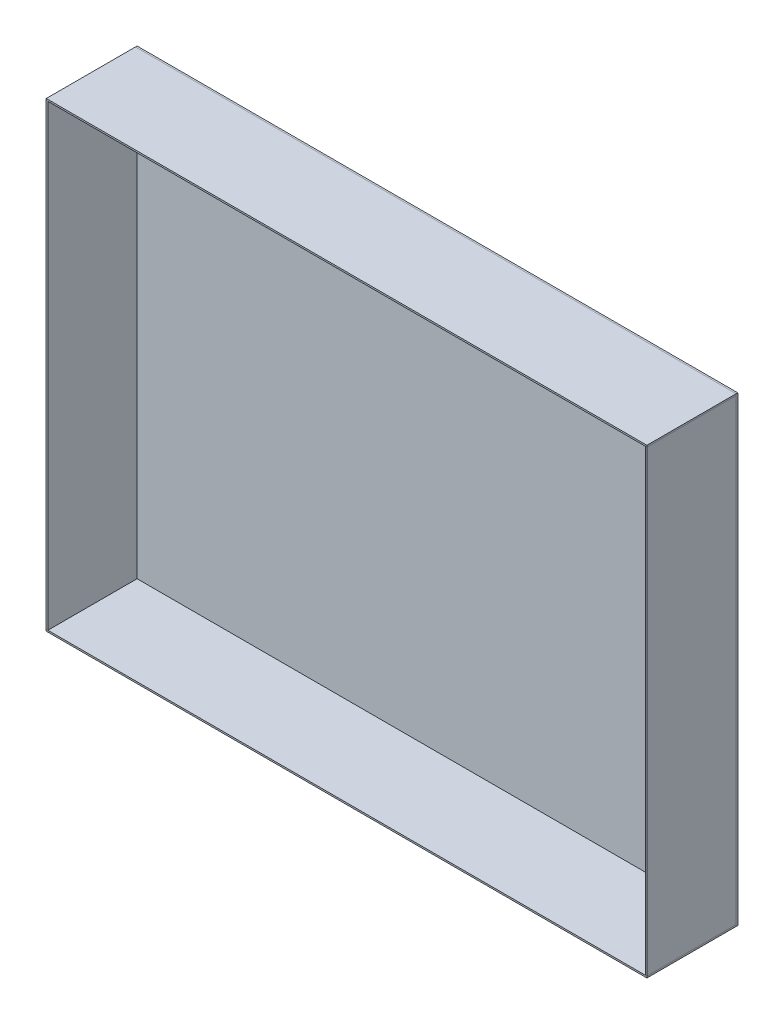
ISO-10303-21;
HEADER;
FILE_DESCRIPTION(('STEP AP214'),'2;1');
FILE_NAME('part.step','',(''),(''),'','','');
FILE_SCHEMA(('AUTOMOTIVE_DESIGN { 1 0 10303 214 1 1 1 1 }'));
ENDSEC;
DATA;
#1=APPLICATION_CONTEXT('core data for automotive mechanical design processes');
#2=APPLICATION_PROTOCOL_DEFINITION('international standard','automotive_design',2000,#1);
#3=PRODUCT_CONTEXT('',#1,'mechanical');
#4=PRODUCT('Part','Part','',(#3));
#5=PRODUCT_RELATED_PRODUCT_CATEGORY('part','',(#4));
#6=PRODUCT_DEFINITION_FORMATION('','',#4);
#7=PRODUCT_DEFINITION_CONTEXT('part definition',#1,'design');
#8=PRODUCT_DEFINITION('design','',#6,#7);
#9=PRODUCT_DEFINITION_SHAPE('','',#8);
#10=(LENGTH_UNIT() NAMED_UNIT(*) SI_UNIT(.MILLI.,.METRE.));
#11=(NAMED_UNIT(*) PLANE_ANGLE_UNIT() SI_UNIT($,.RADIAN.));
#12=(NAMED_UNIT(*) SI_UNIT($,.STERADIAN.) SOLID_ANGLE_UNIT());
#13=UNCERTAINTY_MEASURE_WITH_UNIT(LENGTH_MEASURE(1.E-05),#10,'distance_accuracy_value','');
#14=(GEOMETRIC_REPRESENTATION_CONTEXT(3) GLOBAL_UNCERTAINTY_ASSIGNED_CONTEXT((#13)) GLOBAL_UNIT_ASSIGNED_CONTEXT((#10,
#11,#12)) REPRESENTATION_CONTEXT('',''));
#15=CARTESIAN_POINT('',(0.,0.,0.));
#16=DIRECTION('',(0.,0.,1.));
#17=DIRECTION('',(1.,0.,0.));
#18=AXIS2_PLACEMENT_3D('',#15,#16,#17);
#19=CARTESIAN_POINT('',(0.,0.,-70.));
#20=DIRECTION('',(0.,0.,1.));
#21=DIRECTION('',(1.,0.,0.));
#22=AXIS2_PLACEMENT_3D('',#19,#20,#21);
#23=PLANE('',#22);
#24=DIRECTION('',(-1.,0.,0.));
#25=VECTOR('',#24,1.);
#26=CARTESIAN_POINT('',(0.,-212.,-70.));
#27=LINE('',#26,#25);
#28=CARTESIAN_POINT('',(276.,-212.,-70.));
#29=VERTEX_POINT('',#28);
#30=CARTESIAN_POINT('',(-276.,-212.,-70.));
#31=VERTEX_POINT('',#30);
#32=EDGE_CURVE('P0_E11',#29,#31,#27,.T.);
#33=ORIENTED_EDGE('',*,*,#32,.F.);
#34=DIRECTION('',(0.,-1.,0.));
#35=VECTOR('',#34,1.);
#36=CARTESIAN_POINT('',(276.,0.,-70.));
#37=LINE('',#36,#35);
#38=CARTESIAN_POINT('',(276.,212.,-70.));
#39=VERTEX_POINT('',#38);
#40=EDGE_CURVE('P0_E62',#39,#29,#37,.T.);
#41=ORIENTED_EDGE('',*,*,#40,.F.);
#42=DIRECTION('',(1.,0.,0.));
#43=VECTOR('',#42,1.);
#44=CARTESIAN_POINT('',(0.,212.,-70.));
#45=LINE('',#44,#43);
#46=CARTESIAN_POINT('',(-276.,212.,-70.));
#47=VERTEX_POINT('',#46);
#48=EDGE_CURVE('P0_E98',#47,#39,#45,.T.);
#49=ORIENTED_EDGE('',*,*,#48,.F.);
#50=DIRECTION('',(0.,1.,0.));
#51=VECTOR('',#50,1.);
#52=CARTESIAN_POINT('',(-276.,0.,-70.));
#53=LINE('',#52,#51);
#54=EDGE_CURVE('P0_E25',#31,#47,#53,.T.);
#55=ORIENTED_EDGE('',*,*,#54,.F.);
#56=EDGE_LOOP('',(#33,#41,#49,#55));
#57=FACE_BOUND('',#56,.T.);
#58=ADVANCED_FACE('P0_F17',(#57),#23,.T.);
#59=CARTESIAN_POINT('',(0.,-212.,-71.5));
#60=DIRECTION('',(0.,-1.,0.));
#61=DIRECTION('',(0.,0.,-1.));
#62=AXIS2_PLACEMENT_3D('',#59,#60,#61);
#63=PLANE('',#62);
#64=DIRECTION('',(0.,0.,1.));
#65=VECTOR('',#64,1.);
#66=CARTESIAN_POINT('',(276.,-212.,-71.5));
#67=LINE('',#66,#65);
#68=CARTESIAN_POINT('',(276.,-212.,-71.5));
#69=VERTEX_POINT('',#68);
#70=EDGE_CURVE('P0_E55',#69,#29,#67,.T.);
#71=ORIENTED_EDGE('',*,*,#70,.T.);
#72=ORIENTED_EDGE('',*,*,#32,.T.);
#73=DIRECTION('',(0.,0.,1.));
#74=VECTOR('',#73,1.);
#75=CARTESIAN_POINT('',(-276.,-212.,-71.5));
#76=LINE('',#75,#74);
#77=CARTESIAN_POINT('',(-276.,-212.,-71.5));
#78=VERTEX_POINT('',#77);
#79=EDGE_CURVE('P0_E69',#78,#31,#76,.T.);
#80=ORIENTED_EDGE('',*,*,#79,.F.);
#81=DIRECTION('',(1.,0.,0.));
#82=VECTOR('',#81,1.);
#83=CARTESIAN_POINT('',(0.,-212.,-71.5));
#84=LINE('',#83,#82);
#85=EDGE_CURVE('P0_E67',#78,#69,#84,.T.);
#86=ORIENTED_EDGE('',*,*,#85,.T.);
#87=EDGE_LOOP('',(#71,#72,#80,#86));
#88=FACE_BOUND('',#87,.T.);
#89=ADVANCED_FACE('P0_F68',(#88),#63,.T.);
#90=CARTESIAN_POINT('',(-276.,0.,-71.5));
#91=DIRECTION('',(-1.,0.,0.));
#92=DIRECTION('',(0.,0.,1.));
#93=AXIS2_PLACEMENT_3D('',#90,#91,#92);
#94=PLANE('',#93);
#95=ORIENTED_EDGE('',*,*,#79,.T.);
#96=ORIENTED_EDGE('',*,*,#54,.T.);
#97=DIRECTION('',(0.,0.,1.));
#98=VECTOR('',#97,1.);
#99=CARTESIAN_POINT('',(-276.,212.,-71.5));
#100=LINE('',#99,#98);
#101=CARTESIAN_POINT('',(-276.,212.,-71.5));
#102=VERTEX_POINT('',#101);
#103=EDGE_CURVE('P0_E90',#102,#47,#100,.T.);
#104=ORIENTED_EDGE('',*,*,#103,.F.);
#105=DIRECTION('',(0.,-1.,0.));
#106=VECTOR('',#105,1.);
#107=CARTESIAN_POINT('',(-276.,0.,-71.5));
#108=LINE('',#107,#106);
#109=EDGE_CURVE('P0_E74',#102,#78,#108,.T.);
#110=ORIENTED_EDGE('',*,*,#109,.T.);
#111=EDGE_LOOP('',(#95,#96,#104,#110));
#112=FACE_BOUND('',#111,.T.);
#113=ADVANCED_FACE('P0_F106',(#112),#94,.T.);
#114=CARTESIAN_POINT('',(0.,212.,-71.5));
#115=DIRECTION('',(0.,1.,0.));
#116=DIRECTION('',(0.,0.,1.));
#117=AXIS2_PLACEMENT_3D('',#114,#115,#116);
#118=PLANE('',#117);
#119=ORIENTED_EDGE('',*,*,#103,.T.);
#120=ORIENTED_EDGE('',*,*,#48,.T.);
#121=DIRECTION('',(0.,0.,1.));
#122=VECTOR('',#121,1.);
#123=CARTESIAN_POINT('',(276.,212.,-71.5));
#124=LINE('',#123,#122);
#125=CARTESIAN_POINT('',(276.,212.,-71.5));
#126=VERTEX_POINT('',#125);
#127=EDGE_CURVE('P0_E64',#126,#39,#124,.T.);
#128=ORIENTED_EDGE('',*,*,#127,.F.);
#129=DIRECTION('',(-1.,0.,0.));
#130=VECTOR('',#129,1.);
#131=CARTESIAN_POINT('',(0.,212.,-71.5));
#132=LINE('',#131,#130);
#133=EDGE_CURVE('P0_E79',#126,#102,#132,.T.);
#134=ORIENTED_EDGE('',*,*,#133,.T.);
#135=EDGE_LOOP('',(#119,#120,#128,#134));
#136=FACE_BOUND('',#135,.T.);
#137=ADVANCED_FACE('P0_F104',(#136),#118,.T.);
#138=CARTESIAN_POINT('',(0.,0.,-71.5));
#139=DIRECTION('',(0.,0.,-1.));
#140=DIRECTION('',(-1.,0.,0.));
#141=AXIS2_PLACEMENT_3D('',#138,#139,#140);
#142=PLANE('',#141);
#143=DIRECTION('',(0.,1.,0.));
#144=VECTOR('',#143,1.);
#145=CARTESIAN_POINT('',(276.,0.,-71.5));
#146=LINE('',#145,#144);
#147=EDGE_CURVE('P0_E60',#69,#126,#146,.T.);
#148=ORIENTED_EDGE('',*,*,#147,.F.);
#149=ORIENTED_EDGE('',*,*,#85,.F.);
#150=ORIENTED_EDGE('',*,*,#109,.F.);
#151=ORIENTED_EDGE('',*,*,#133,.F.);
#152=EDGE_LOOP('',(#148,#149,#150,#151));
#153=FACE_BOUND('',#152,.T.);
#154=ADVANCED_FACE('P0_F77',(#153),#142,.T.);
#155=CARTESIAN_POINT('',(276.,0.,-71.5));
#156=DIRECTION('',(1.,0.,0.));
#157=DIRECTION('',(0.,0.,-1.));
#158=AXIS2_PLACEMENT_3D('',#155,#156,#157);
#159=PLANE('',#158);
#160=ORIENTED_EDGE('',*,*,#147,.T.);
#161=ORIENTED_EDGE('',*,*,#127,.T.);
#162=ORIENTED_EDGE('',*,*,#40,.T.);
#163=ORIENTED_EDGE('',*,*,#70,.F.);
#164=EDGE_LOOP('',(#160,#161,#162,#163));
#165=FACE_BOUND('',#164,.T.);
#166=ADVANCED_FACE('P0_F57',(#165),#159,.T.);
#167=CLOSED_SHELL('',(#58,#89,#113,#137,#154,#166));
#168=MANIFOLD_SOLID_BREP('P0_B1',#167);
#169=CARTESIAN_POINT('',(-275.25,0.,12.));
#170=DIRECTION('',(0.,0.,1.));
#171=DIRECTION('',(1.,0.,0.));
#172=AXIS2_PLACEMENT_3D('',#169,#170,#171);
#173=PLANE('',#172);
#174=DIRECTION('',(-1.,0.,0.));
#175=VECTOR('',#174,1.);
#176=CARTESIAN_POINT('',(-275.25,-210.5,12.));
#177=LINE('',#176,#175);
#178=CARTESIAN_POINT('',(-274.5,-210.5,12.));
#179=VERTEX_POINT('',#178);
#180=CARTESIAN_POINT('',(-276.,-210.5,12.));
#181=VERTEX_POINT('',#180);
#182=EDGE_CURVE('P1_E11',#179,#181,#177,.T.);
#183=ORIENTED_EDGE('',*,*,#182,.F.);
#184=DIRECTION('',(0.,-1.,0.));
#185=VECTOR('',#184,1.);
#186=CARTESIAN_POINT('',(-274.5,0.,12.));
#187=LINE('',#186,#185);
#188=CARTESIAN_POINT('',(-274.5,210.5,12.));
#189=VERTEX_POINT('',#188);
#190=EDGE_CURVE('P1_E62',#189,#179,#187,.T.);
#191=ORIENTED_EDGE('',*,*,#190,.F.);
#192=DIRECTION('',(1.,0.,0.));
#193=VECTOR('',#192,1.);
#194=CARTESIAN_POINT('',(-275.25,210.5,12.));
#195=LINE('',#194,#193);
#196=CARTESIAN_POINT('',(-276.,210.5,12.));
#197=VERTEX_POINT('',#196);
#198=EDGE_CURVE('P1_E99',#197,#189,#195,.T.);
#199=ORIENTED_EDGE('',*,*,#198,.F.);
#200=DIRECTION('',(0.,1.,0.));
#201=VECTOR('',#200,1.);
#202=CARTESIAN_POINT('',(-276.,0.,12.));
#203=LINE('',#202,#201);
#204=EDGE_CURVE('P1_E25',#181,#197,#203,.T.);
#205=ORIENTED_EDGE('',*,*,#204,.F.);
#206=EDGE_LOOP('',(#183,#191,#199,#205));
#207=FACE_BOUND('',#206,.T.);
#208=ADVANCED_FACE('P1_F17',(#207),#173,.T.);
#209=CARTESIAN_POINT('',(-275.25,-210.5,-70.));
#210=DIRECTION('',(0.,-1.,0.));
#211=DIRECTION('',(0.,0.,-1.));
#212=AXIS2_PLACEMENT_3D('',#209,#210,#211);
#213=PLANE('',#212);
#214=DIRECTION('',(0.,0.,1.));
#215=VECTOR('',#214,1.);
#216=CARTESIAN_POINT('',(-274.5,-210.5,-70.));
#217=LINE('',#216,#215);
#218=CARTESIAN_POINT('',(-274.5,-210.5,-70.));
#219=VERTEX_POINT('',#218);
#220=EDGE_CURVE('P1_E55',#219,#179,#217,.T.);
#221=ORIENTED_EDGE('',*,*,#220,.T.);
#222=ORIENTED_EDGE('',*,*,#182,.T.);
#223=DIRECTION('',(0.,0.,1.));
#224=VECTOR('',#223,1.);
#225=CARTESIAN_POINT('',(-276.,-210.5,-70.));
#226=LINE('',#225,#224);
#227=CARTESIAN_POINT('',(-276.,-210.5,-70.));
#228=VERTEX_POINT('',#227);
#229=EDGE_CURVE('P1_E69',#228,#181,#226,.T.);
#230=ORIENTED_EDGE('',*,*,#229,.F.);
#231=DIRECTION('',(1.,0.,0.));
#232=VECTOR('',#231,1.);
#233=CARTESIAN_POINT('',(-275.25,-210.5,-70.));
#234=LINE('',#233,#232);
#235=EDGE_CURVE('P1_E67',#228,#219,#234,.T.);
#236=ORIENTED_EDGE('',*,*,#235,.T.);
#237=EDGE_LOOP('',(#221,#222,#230,#236));
#238=FACE_BOUND('',#237,.T.);
#239=ADVANCED_FACE('P1_F68',(#238),#213,.T.);
#240=CARTESIAN_POINT('',(-276.,0.,-70.));
#241=DIRECTION('',(-1.,0.,0.));
#242=DIRECTION('',(0.,0.,1.));
#243=AXIS2_PLACEMENT_3D('',#240,#241,#242);
#244=PLANE('',#243);
#245=ORIENTED_EDGE('',*,*,#229,.T.);
#246=ORIENTED_EDGE('',*,*,#204,.T.);
#247=DIRECTION('',(0.,0.,1.));
#248=VECTOR('',#247,1.);
#249=CARTESIAN_POINT('',(-276.,210.5,-70.));
#250=LINE('',#249,#248);
#251=CARTESIAN_POINT('',(-276.,210.5,-70.));
#252=VERTEX_POINT('',#251);
#253=EDGE_CURVE('P1_E92',#252,#197,#250,.T.);
#254=ORIENTED_EDGE('',*,*,#253,.F.);
#255=DIRECTION('',(0.,-1.,0.));
#256=VECTOR('',#255,1.);
#257=CARTESIAN_POINT('',(-276.,0.,-70.));
#258=LINE('',#257,#256);
#259=EDGE_CURVE('P1_E74',#252,#228,#258,.T.);
#260=ORIENTED_EDGE('',*,*,#259,.T.);
#261=EDGE_LOOP('',(#245,#246,#254,#260));
#262=FACE_BOUND('',#261,.T.);
#263=ADVANCED_FACE('P1_F106',(#262),#244,.T.);
#264=CARTESIAN_POINT('',(-275.25,210.5,-70.));
#265=DIRECTION('',(0.,1.,0.));
#266=DIRECTION('',(0.,0.,1.));
#267=AXIS2_PLACEMENT_3D('',#264,#265,#266);
#268=PLANE('',#267);
#269=ORIENTED_EDGE('',*,*,#253,.T.);
#270=ORIENTED_EDGE('',*,*,#198,.T.);
#271=DIRECTION('',(0.,0.,1.));
#272=VECTOR('',#271,1.);
#273=CARTESIAN_POINT('',(-274.5,210.5,-70.));
#274=LINE('',#273,#272);
#275=CARTESIAN_POINT('',(-274.5,210.5,-70.));
#276=VERTEX_POINT('',#275);
#277=EDGE_CURVE('P1_E64',#276,#189,#274,.T.);
#278=ORIENTED_EDGE('',*,*,#277,.F.);
#279=DIRECTION('',(-1.,0.,0.));
#280=VECTOR('',#279,1.);
#281=CARTESIAN_POINT('',(-275.25,210.5,-70.));
#282=LINE('',#281,#280);
#283=EDGE_CURVE('P1_E79',#276,#252,#282,.T.);
#284=ORIENTED_EDGE('',*,*,#283,.T.);
#285=EDGE_LOOP('',(#269,#270,#278,#284));
#286=FACE_BOUND('',#285,.T.);
#287=ADVANCED_FACE('P1_F104',(#286),#268,.T.);
#288=CARTESIAN_POINT('',(-275.25,0.,-70.));
#289=DIRECTION('',(0.,0.,-1.));
#290=DIRECTION('',(-1.,0.,0.));
#291=AXIS2_PLACEMENT_3D('',#288,#289,#290);
#292=PLANE('',#291);
#293=DIRECTION('',(0.,1.,0.));
#294=VECTOR('',#293,1.);
#295=CARTESIAN_POINT('',(-274.5,0.,-70.));
#296=LINE('',#295,#294);
#297=EDGE_CURVE('P1_E60',#219,#276,#296,.T.);
#298=ORIENTED_EDGE('',*,*,#297,.F.);
#299=ORIENTED_EDGE('',*,*,#235,.F.);
#300=ORIENTED_EDGE('',*,*,#259,.F.);
#301=ORIENTED_EDGE('',*,*,#283,.F.);
#302=EDGE_LOOP('',(#298,#299,#300,#301));
#303=FACE_BOUND('',#302,.T.);
#304=ADVANCED_FACE('P1_F77',(#303),#292,.T.);
#305=CARTESIAN_POINT('',(-274.5,0.,-70.));
#306=DIRECTION('',(1.,0.,0.));
#307=DIRECTION('',(0.,0.,-1.));
#308=AXIS2_PLACEMENT_3D('',#305,#306,#307);
#309=PLANE('',#308);
#310=ORIENTED_EDGE('',*,*,#297,.T.);
#311=ORIENTED_EDGE('',*,*,#277,.T.);
#312=ORIENTED_EDGE('',*,*,#190,.T.);
#313=ORIENTED_EDGE('',*,*,#220,.F.);
#314=EDGE_LOOP('',(#310,#311,#312,#313));
#315=FACE_BOUND('',#314,.T.);
#316=ADVANCED_FACE('P1_F57',(#315),#309,.T.);
#317=CLOSED_SHELL('',(#208,#239,#263,#287,#304,#316));
#318=MANIFOLD_SOLID_BREP('P1_B1',#317);
#319=CARTESIAN_POINT('',(0.,-211.25,12.));
#320=DIRECTION('',(0.,0.,1.));
#321=DIRECTION('',(1.,0.,0.));
#322=AXIS2_PLACEMENT_3D('',#319,#320,#321);
#323=PLANE('',#322);
#324=DIRECTION('',(-1.,0.,0.));
#325=VECTOR('',#324,1.);
#326=CARTESIAN_POINT('',(0.,-212.,12.));
#327=LINE('',#326,#325);
#328=CARTESIAN_POINT('',(276.,-212.,12.));
#329=VERTEX_POINT('',#328);
#330=CARTESIAN_POINT('',(-276.,-212.,12.));
#331=VERTEX_POINT('',#330);
#332=EDGE_CURVE('P2_E11',#329,#331,#327,.T.);
#333=ORIENTED_EDGE('',*,*,#332,.F.);
#334=DIRECTION('',(0.,-1.,0.));
#335=VECTOR('',#334,1.);
#336=CARTESIAN_POINT('',(276.,-211.25,12.));
#337=LINE('',#336,#335);
#338=CARTESIAN_POINT('',(276.,-210.5,12.));
#339=VERTEX_POINT('',#338);
#340=EDGE_CURVE('P2_E62',#339,#329,#337,.T.);
#341=ORIENTED_EDGE('',*,*,#340,.F.);
#342=DIRECTION('',(1.,0.,0.));
#343=VECTOR('',#342,1.);
#344=CARTESIAN_POINT('',(0.,-210.5,12.));
#345=LINE('',#344,#343);
#346=CARTESIAN_POINT('',(-276.,-210.5,12.));
#347=VERTEX_POINT('',#346);
#348=EDGE_CURVE('P2_E99',#347,#339,#345,.T.);
#349=ORIENTED_EDGE('',*,*,#348,.F.);
#350=DIRECTION('',(0.,1.,0.));
#351=VECTOR('',#350,1.);
#352=CARTESIAN_POINT('',(-276.,-211.25,12.));
#353=LINE('',#352,#351);
#354=EDGE_CURVE('P2_E25',#331,#347,#353,.T.);
#355=ORIENTED_EDGE('',*,*,#354,.F.);
#356=EDGE_LOOP('',(#333,#341,#349,#355));
#357=FACE_BOUND('',#356,.T.);
#358=ADVANCED_FACE('P2_F17',(#357),#323,.T.);
#359=CARTESIAN_POINT('',(0.,-212.,-70.));
#360=DIRECTION('',(0.,-1.,0.));
#361=DIRECTION('',(0.,0.,-1.));
#362=AXIS2_PLACEMENT_3D('',#359,#360,#361);
#363=PLANE('',#362);
#364=DIRECTION('',(0.,0.,1.));
#365=VECTOR('',#364,1.);
#366=CARTESIAN_POINT('',(276.,-212.,-70.));
#367=LINE('',#366,#365);
#368=CARTESIAN_POINT('',(276.,-212.,-70.));
#369=VERTEX_POINT('',#368);
#370=EDGE_CURVE('P2_E55',#369,#329,#367,.T.);
#371=ORIENTED_EDGE('',*,*,#370,.T.);
#372=ORIENTED_EDGE('',*,*,#332,.T.);
#373=DIRECTION('',(0.,0.,1.));
#374=VECTOR('',#373,1.);
#375=CARTESIAN_POINT('',(-276.,-212.,-70.));
#376=LINE('',#375,#374);
#377=CARTESIAN_POINT('',(-276.,-212.,-70.));
#378=VERTEX_POINT('',#377);
#379=EDGE_CURVE('P2_E69',#378,#331,#376,.T.);
#380=ORIENTED_EDGE('',*,*,#379,.F.);
#381=DIRECTION('',(1.,0.,0.));
#382=VECTOR('',#381,1.);
#383=CARTESIAN_POINT('',(0.,-212.,-70.));
#384=LINE('',#383,#382);
#385=EDGE_CURVE('P2_E67',#378,#369,#384,.T.);
#386=ORIENTED_EDGE('',*,*,#385,.T.);
#387=EDGE_LOOP('',(#371,#372,#380,#386));
#388=FACE_BOUND('',#387,.T.);
#389=ADVANCED_FACE('P2_F68',(#388),#363,.T.);
#390=CARTESIAN_POINT('',(-276.,-211.25,-70.));
#391=DIRECTION('',(-1.,0.,0.));
#392=DIRECTION('',(0.,0.,1.));
#393=AXIS2_PLACEMENT_3D('',#390,#391,#392);
#394=PLANE('',#393);
#395=ORIENTED_EDGE('',*,*,#379,.T.);
#396=ORIENTED_EDGE('',*,*,#354,.T.);
#397=DIRECTION('',(0.,0.,1.));
#398=VECTOR('',#397,1.);
#399=CARTESIAN_POINT('',(-276.,-210.5,-70.));
#400=LINE('',#399,#398);
#401=CARTESIAN_POINT('',(-276.,-210.5,-70.));
#402=VERTEX_POINT('',#401);
#403=EDGE_CURVE('P2_E92',#402,#347,#400,.T.);
#404=ORIENTED_EDGE('',*,*,#403,.F.);
#405=DIRECTION('',(0.,-1.,0.));
#406=VECTOR('',#405,1.);
#407=CARTESIAN_POINT('',(-276.,-211.25,-70.));
#408=LINE('',#407,#406);
#409=EDGE_CURVE('P2_E74',#402,#378,#408,.T.);
#410=ORIENTED_EDGE('',*,*,#409,.T.);
#411=EDGE_LOOP('',(#395,#396,#404,#410));
#412=FACE_BOUND('',#411,.T.);
#413=ADVANCED_FACE('P2_F106',(#412),#394,.T.);
#414=CARTESIAN_POINT('',(0.,-210.5,-70.));
#415=DIRECTION('',(0.,1.,0.));
#416=DIRECTION('',(0.,0.,1.));
#417=AXIS2_PLACEMENT_3D('',#414,#415,#416);
#418=PLANE('',#417);
#419=ORIENTED_EDGE('',*,*,#403,.T.);
#420=ORIENTED_EDGE('',*,*,#348,.T.);
#421=DIRECTION('',(0.,0.,1.));
#422=VECTOR('',#421,1.);
#423=CARTESIAN_POINT('',(276.,-210.5,-70.));
#424=LINE('',#423,#422);
#425=CARTESIAN_POINT('',(276.,-210.5,-70.));
#426=VERTEX_POINT('',#425);
#427=EDGE_CURVE('P2_E64',#426,#339,#424,.T.);
#428=ORIENTED_EDGE('',*,*,#427,.F.);
#429=DIRECTION('',(-1.,0.,0.));
#430=VECTOR('',#429,1.);
#431=CARTESIAN_POINT('',(0.,-210.5,-70.));
#432=LINE('',#431,#430);
#433=EDGE_CURVE('P2_E79',#426,#402,#432,.T.);
#434=ORIENTED_EDGE('',*,*,#433,.T.);
#435=EDGE_LOOP('',(#419,#420,#428,#434));
#436=FACE_BOUND('',#435,.T.);
#437=ADVANCED_FACE('P2_F104',(#436),#418,.T.);
#438=CARTESIAN_POINT('',(0.,-211.25,-70.));
#439=DIRECTION('',(0.,0.,-1.));
#440=DIRECTION('',(-1.,0.,0.));
#441=AXIS2_PLACEMENT_3D('',#438,#439,#440);
#442=PLANE('',#441);
#443=DIRECTION('',(0.,1.,0.));
#444=VECTOR('',#443,1.);
#445=CARTESIAN_POINT('',(276.,-211.25,-70.));
#446=LINE('',#445,#444);
#447=EDGE_CURVE('P2_E60',#369,#426,#446,.T.);
#448=ORIENTED_EDGE('',*,*,#447,.F.);
#449=ORIENTED_EDGE('',*,*,#385,.F.);
#450=ORIENTED_EDGE('',*,*,#409,.F.);
#451=ORIENTED_EDGE('',*,*,#433,.F.);
#452=EDGE_LOOP('',(#448,#449,#450,#451));
#453=FACE_BOUND('',#452,.T.);
#454=ADVANCED_FACE('P2_F77',(#453),#442,.T.);
#455=CARTESIAN_POINT('',(276.,-211.25,-70.));
#456=DIRECTION('',(1.,0.,0.));
#457=DIRECTION('',(0.,0.,-1.));
#458=AXIS2_PLACEMENT_3D('',#455,#456,#457);
#459=PLANE('',#458);
#460=ORIENTED_EDGE('',*,*,#447,.T.);
#461=ORIENTED_EDGE('',*,*,#427,.T.);
#462=ORIENTED_EDGE('',*,*,#340,.T.);
#463=ORIENTED_EDGE('',*,*,#370,.F.);
#464=EDGE_LOOP('',(#460,#461,#462,#463));
#465=FACE_BOUND('',#464,.T.);
#466=ADVANCED_FACE('P2_F57',(#465),#459,.T.);
#467=CLOSED_SHELL('',(#358,#389,#413,#437,#454,#466));
#468=MANIFOLD_SOLID_BREP('P2_B1',#467);
#469=CARTESIAN_POINT('',(275.25,0.,12.));
#470=DIRECTION('',(0.,0.,1.));
#471=DIRECTION('',(1.,0.,0.));
#472=AXIS2_PLACEMENT_3D('',#469,#470,#471);
#473=PLANE('',#472);
#474=DIRECTION('',(-1.,0.,0.));
#475=VECTOR('',#474,1.);
#476=CARTESIAN_POINT('',(275.25,-210.5,12.));
#477=LINE('',#476,#475);
#478=CARTESIAN_POINT('',(276.,-210.5,12.));
#479=VERTEX_POINT('',#478);
#480=CARTESIAN_POINT('',(274.5,-210.5,12.));
#481=VERTEX_POINT('',#480);
#482=EDGE_CURVE('P3_E11',#479,#481,#477,.T.);
#483=ORIENTED_EDGE('',*,*,#482,.F.);
#484=DIRECTION('',(0.,-1.,0.));
#485=VECTOR('',#484,1.);
#486=CARTESIAN_POINT('',(276.,0.,12.));
#487=LINE('',#486,#485);
#488=CARTESIAN_POINT('',(276.,210.5,12.));
#489=VERTEX_POINT('',#488);
#490=EDGE_CURVE('P3_E62',#489,#479,#487,.T.);
#491=ORIENTED_EDGE('',*,*,#490,.F.);
#492=DIRECTION('',(1.,0.,0.));
#493=VECTOR('',#492,1.);
#494=CARTESIAN_POINT('',(275.25,210.5,12.));
#495=LINE('',#494,#493);
#496=CARTESIAN_POINT('',(274.5,210.5,12.));
#497=VERTEX_POINT('',#496);
#498=EDGE_CURVE('P3_E99',#497,#489,#495,.T.);
#499=ORIENTED_EDGE('',*,*,#498,.F.);
#500=DIRECTION('',(0.,1.,0.));
#501=VECTOR('',#500,1.);
#502=CARTESIAN_POINT('',(274.5,0.,12.));
#503=LINE('',#502,#501);
#504=EDGE_CURVE('P3_E25',#481,#497,#503,.T.);
#505=ORIENTED_EDGE('',*,*,#504,.F.);
#506=EDGE_LOOP('',(#483,#491,#499,#505));
#507=FACE_BOUND('',#506,.T.);
#508=ADVANCED_FACE('P3_F17',(#507),#473,.T.);
#509=CARTESIAN_POINT('',(275.25,-210.5,-70.));
#510=DIRECTION('',(0.,-1.,0.));
#511=DIRECTION('',(0.,0.,-1.));
#512=AXIS2_PLACEMENT_3D('',#509,#510,#511);
#513=PLANE('',#512);
#514=DIRECTION('',(0.,0.,1.));
#515=VECTOR('',#514,1.);
#516=CARTESIAN_POINT('',(276.,-210.5,-70.));
#517=LINE('',#516,#515);
#518=CARTESIAN_POINT('',(276.,-210.5,-70.));
#519=VERTEX_POINT('',#518);
#520=EDGE_CURVE('P3_E55',#519,#479,#517,.T.);
#521=ORIENTED_EDGE('',*,*,#520,.T.);
#522=ORIENTED_EDGE('',*,*,#482,.T.);
#523=DIRECTION('',(0.,0.,1.));
#524=VECTOR('',#523,1.);
#525=CARTESIAN_POINT('',(274.5,-210.5,-70.));
#526=LINE('',#525,#524);
#527=CARTESIAN_POINT('',(274.5,-210.5,-70.));
#528=VERTEX_POINT('',#527);
#529=EDGE_CURVE('P3_E69',#528,#481,#526,.T.);
#530=ORIENTED_EDGE('',*,*,#529,.F.);
#531=DIRECTION('',(1.,0.,0.));
#532=VECTOR('',#531,1.);
#533=CARTESIAN_POINT('',(275.25,-210.5,-70.));
#534=LINE('',#533,#532);
#535=EDGE_CURVE('P3_E67',#528,#519,#534,.T.);
#536=ORIENTED_EDGE('',*,*,#535,.T.);
#537=EDGE_LOOP('',(#521,#522,#530,#536));
#538=FACE_BOUND('',#537,.T.);
#539=ADVANCED_FACE('P3_F68',(#538),#513,.T.);
#540=CARTESIAN_POINT('',(274.5,0.,-70.));
#541=DIRECTION('',(-1.,0.,0.));
#542=DIRECTION('',(0.,0.,1.));
#543=AXIS2_PLACEMENT_3D('',#540,#541,#542);
#544=PLANE('',#543);
#545=ORIENTED_EDGE('',*,*,#529,.T.);
#546=ORIENTED_EDGE('',*,*,#504,.T.);
#547=DIRECTION('',(0.,0.,1.));
#548=VECTOR('',#547,1.);
#549=CARTESIAN_POINT('',(274.5,210.5,-70.));
#550=LINE('',#549,#548);
#551=CARTESIAN_POINT('',(274.5,210.5,-70.));
#552=VERTEX_POINT('',#551);
#553=EDGE_CURVE('P3_E91',#552,#497,#550,.T.);
#554=ORIENTED_EDGE('',*,*,#553,.F.);
#555=DIRECTION('',(0.,-1.,0.));
#556=VECTOR('',#555,1.);
#557=CARTESIAN_POINT('',(274.5,0.,-70.));
#558=LINE('',#557,#556);
#559=EDGE_CURVE('P3_E74',#552,#528,#558,.T.);
#560=ORIENTED_EDGE('',*,*,#559,.T.);
#561=EDGE_LOOP('',(#545,#546,#554,#560));
#562=FACE_BOUND('',#561,.T.);
#563=ADVANCED_FACE('P3_F106',(#562),#544,.T.);
#564=CARTESIAN_POINT('',(275.25,210.5,-70.));
#565=DIRECTION('',(0.,1.,0.));
#566=DIRECTION('',(0.,0.,1.));
#567=AXIS2_PLACEMENT_3D('',#564,#565,#566);
#568=PLANE('',#567);
#569=ORIENTED_EDGE('',*,*,#553,.T.);
#570=ORIENTED_EDGE('',*,*,#498,.T.);
#571=DIRECTION('',(0.,0.,1.));
#572=VECTOR('',#571,1.);
#573=CARTESIAN_POINT('',(276.,210.5,-70.));
#574=LINE('',#573,#572);
#575=CARTESIAN_POINT('',(276.,210.5,-70.));
#576=VERTEX_POINT('',#575);
#577=EDGE_CURVE('P3_E64',#576,#489,#574,.T.);
#578=ORIENTED_EDGE('',*,*,#577,.F.);
#579=DIRECTION('',(-1.,0.,0.));
#580=VECTOR('',#579,1.);
#581=CARTESIAN_POINT('',(275.25,210.5,-70.));
#582=LINE('',#581,#580);
#583=EDGE_CURVE('P3_E79',#576,#552,#582,.T.);
#584=ORIENTED_EDGE('',*,*,#583,.T.);
#585=EDGE_LOOP('',(#569,#570,#578,#584));
#586=FACE_BOUND('',#585,.T.);
#587=ADVANCED_FACE('P3_F104',(#586),#568,.T.);
#588=CARTESIAN_POINT('',(275.25,0.,-70.));
#589=DIRECTION('',(0.,0.,-1.));
#590=DIRECTION('',(-1.,0.,0.));
#591=AXIS2_PLACEMENT_3D('',#588,#589,#590);
#592=PLANE('',#591);
#593=DIRECTION('',(0.,1.,0.));
#594=VECTOR('',#593,1.);
#595=CARTESIAN_POINT('',(276.,0.,-70.));
#596=LINE('',#595,#594);
#597=EDGE_CURVE('P3_E60',#519,#576,#596,.T.);
#598=ORIENTED_EDGE('',*,*,#597,.F.);
#599=ORIENTED_EDGE('',*,*,#535,.F.);
#600=ORIENTED_EDGE('',*,*,#559,.F.);
#601=ORIENTED_EDGE('',*,*,#583,.F.);
#602=EDGE_LOOP('',(#598,#599,#600,#601));
#603=FACE_BOUND('',#602,.T.);
#604=ADVANCED_FACE('P3_F77',(#603),#592,.T.);
#605=CARTESIAN_POINT('',(276.,0.,-70.));
#606=DIRECTION('',(1.,0.,0.));
#607=DIRECTION('',(0.,0.,-1.));
#608=AXIS2_PLACEMENT_3D('',#605,#606,#607);
#609=PLANE('',#608);
#610=ORIENTED_EDGE('',*,*,#597,.T.);
#611=ORIENTED_EDGE('',*,*,#577,.T.);
#612=ORIENTED_EDGE('',*,*,#490,.T.);
#613=ORIENTED_EDGE('',*,*,#520,.F.);
#614=EDGE_LOOP('',(#610,#611,#612,#613));
#615=FACE_BOUND('',#614,.T.);
#616=ADVANCED_FACE('P3_F57',(#615),#609,.T.);
#617=CLOSED_SHELL('',(#508,#539,#563,#587,#604,#616));
#618=MANIFOLD_SOLID_BREP('P3_B1',#617);
#619=CARTESIAN_POINT('',(0.,211.25,12.));
#620=DIRECTION('',(0.,0.,1.));
#621=DIRECTION('',(1.,0.,0.));
#622=AXIS2_PLACEMENT_3D('',#619,#620,#621);
#623=PLANE('',#622);
#624=DIRECTION('',(-1.,0.,0.));
#625=VECTOR('',#624,1.);
#626=CARTESIAN_POINT('',(0.,210.5,12.));
#627=LINE('',#626,#625);
#628=CARTESIAN_POINT('',(276.,210.5,12.));
#629=VERTEX_POINT('',#628);
#630=CARTESIAN_POINT('',(-276.,210.5,12.));
#631=VERTEX_POINT('',#630);
#632=EDGE_CURVE('P4_E11',#629,#631,#627,.T.);
#633=ORIENTED_EDGE('',*,*,#632,.F.);
#634=DIRECTION('',(0.,-1.,0.));
#635=VECTOR('',#634,1.);
#636=CARTESIAN_POINT('',(276.,211.25,12.));
#637=LINE('',#636,#635);
#638=CARTESIAN_POINT('',(276.,212.,12.));
#639=VERTEX_POINT('',#638);
#640=EDGE_CURVE('P4_E62',#639,#629,#637,.T.);
#641=ORIENTED_EDGE('',*,*,#640,.F.);
#642=DIRECTION('',(1.,0.,0.));
#643=VECTOR('',#642,1.);
#644=CARTESIAN_POINT('',(0.,212.,12.));
#645=LINE('',#644,#643);
#646=CARTESIAN_POINT('',(-276.,212.,12.));
#647=VERTEX_POINT('',#646);
#648=EDGE_CURVE('P4_E98',#647,#639,#645,.T.);
#649=ORIENTED_EDGE('',*,*,#648,.F.);
#650=DIRECTION('',(0.,1.,0.));
#651=VECTOR('',#650,1.);
#652=CARTESIAN_POINT('',(-276.,211.25,12.));
#653=LINE('',#652,#651);
#654=EDGE_CURVE('P4_E25',#631,#647,#653,.T.);
#655=ORIENTED_EDGE('',*,*,#654,.F.);
#656=EDGE_LOOP('',(#633,#641,#649,#655));
#657=FACE_BOUND('',#656,.T.);
#658=ADVANCED_FACE('P4_F17',(#657),#623,.T.);
#659=CARTESIAN_POINT('',(0.,210.5,-70.));
#660=DIRECTION('',(0.,-1.,0.));
#661=DIRECTION('',(0.,0.,-1.));
#662=AXIS2_PLACEMENT_3D('',#659,#660,#661);
#663=PLANE('',#662);
#664=DIRECTION('',(0.,0.,1.));
#665=VECTOR('',#664,1.);
#666=CARTESIAN_POINT('',(276.,210.5,-70.));
#667=LINE('',#666,#665);
#668=CARTESIAN_POINT('',(276.,210.5,-70.));
#669=VERTEX_POINT('',#668);
#670=EDGE_CURVE('P4_E55',#669,#629,#667,.T.);
#671=ORIENTED_EDGE('',*,*,#670,.T.);
#672=ORIENTED_EDGE('',*,*,#632,.T.);
#673=DIRECTION('',(0.,0.,1.));
#674=VECTOR('',#673,1.);
#675=CARTESIAN_POINT('',(-276.,210.5,-70.));
#676=LINE('',#675,#674);
#677=CARTESIAN_POINT('',(-276.,210.5,-70.));
#678=VERTEX_POINT('',#677);
#679=EDGE_CURVE('P4_E69',#678,#631,#676,.T.);
#680=ORIENTED_EDGE('',*,*,#679,.F.);
#681=DIRECTION('',(1.,0.,0.));
#682=VECTOR('',#681,1.);
#683=CARTESIAN_POINT('',(0.,210.5,-70.));
#684=LINE('',#683,#682);
#685=EDGE_CURVE('P4_E67',#678,#669,#684,.T.);
#686=ORIENTED_EDGE('',*,*,#685,.T.);
#687=EDGE_LOOP('',(#671,#672,#680,#686));
#688=FACE_BOUND('',#687,.T.);
#689=ADVANCED_FACE('P4_F68',(#688),#663,.T.);
#690=CARTESIAN_POINT('',(-276.,211.25,-70.));
#691=DIRECTION('',(-1.,0.,0.));
#692=DIRECTION('',(0.,0.,1.));
#693=AXIS2_PLACEMENT_3D('',#690,#691,#692);
#694=PLANE('',#693);
#695=ORIENTED_EDGE('',*,*,#679,.T.);
#696=ORIENTED_EDGE('',*,*,#654,.T.);
#697=DIRECTION('',(0.,0.,1.));
#698=VECTOR('',#697,1.);
#699=CARTESIAN_POINT('',(-276.,212.,-70.));
#700=LINE('',#699,#698);
#701=CARTESIAN_POINT('',(-276.,212.,-70.));
#702=VERTEX_POINT('',#701);
#703=EDGE_CURVE('P4_E90',#702,#647,#700,.T.);
#704=ORIENTED_EDGE('',*,*,#703,.F.);
#705=DIRECTION('',(0.,-1.,0.));
#706=VECTOR('',#705,1.);
#707=CARTESIAN_POINT('',(-276.,211.25,-70.));
#708=LINE('',#707,#706);
#709=EDGE_CURVE('P4_E74',#702,#678,#708,.T.);
#710=ORIENTED_EDGE('',*,*,#709,.T.);
#711=EDGE_LOOP('',(#695,#696,#704,#710));
#712=FACE_BOUND('',#711,.T.);
#713=ADVANCED_FACE('P4_F106',(#712),#694,.T.);
#714=CARTESIAN_POINT('',(0.,212.,-70.));
#715=DIRECTION('',(0.,1.,0.));
#716=DIRECTION('',(0.,0.,1.));
#717=AXIS2_PLACEMENT_3D('',#714,#715,#716);
#718=PLANE('',#717);
#719=ORIENTED_EDGE('',*,*,#703,.T.);
#720=ORIENTED_EDGE('',*,*,#648,.T.);
#721=DIRECTION('',(0.,0.,1.));
#722=VECTOR('',#721,1.);
#723=CARTESIAN_POINT('',(276.,212.,-70.));
#724=LINE('',#723,#722);
#725=CARTESIAN_POINT('',(276.,212.,-70.));
#726=VERTEX_POINT('',#725);
#727=EDGE_CURVE('P4_E64',#726,#639,#724,.T.);
#728=ORIENTED_EDGE('',*,*,#727,.F.);
#729=DIRECTION('',(-1.,0.,0.));
#730=VECTOR('',#729,1.);
#731=CARTESIAN_POINT('',(0.,212.,-70.));
#732=LINE('',#731,#730);
#733=EDGE_CURVE('P4_E79',#726,#702,#732,.T.);
#734=ORIENTED_EDGE('',*,*,#733,.T.);
#735=EDGE_LOOP('',(#719,#720,#728,#734));
#736=FACE_BOUND('',#735,.T.);
#737=ADVANCED_FACE('P4_F104',(#736),#718,.T.);
#738=CARTESIAN_POINT('',(0.,211.25,-70.));
#739=DIRECTION('',(0.,0.,-1.));
#740=DIRECTION('',(-1.,0.,0.));
#741=AXIS2_PLACEMENT_3D('',#738,#739,#740);
#742=PLANE('',#741);
#743=DIRECTION('',(0.,1.,0.));
#744=VECTOR('',#743,1.);
#745=CARTESIAN_POINT('',(276.,211.25,-70.));
#746=LINE('',#745,#744);
#747=EDGE_CURVE('P4_E60',#669,#726,#746,.T.);
#748=ORIENTED_EDGE('',*,*,#747,.F.);
#749=ORIENTED_EDGE('',*,*,#685,.F.);
#750=ORIENTED_EDGE('',*,*,#709,.F.);
#751=ORIENTED_EDGE('',*,*,#733,.F.);
#752=EDGE_LOOP('',(#748,#749,#750,#751));
#753=FACE_BOUND('',#752,.T.);
#754=ADVANCED_FACE('P4_F77',(#753),#742,.T.);
#755=CARTESIAN_POINT('',(276.,211.25,-70.));
#756=DIRECTION('',(1.,0.,0.));
#757=DIRECTION('',(0.,0.,-1.));
#758=AXIS2_PLACEMENT_3D('',#755,#756,#757);
#759=PLANE('',#758);
#760=ORIENTED_EDGE('',*,*,#747,.T.);
#761=ORIENTED_EDGE('',*,*,#727,.T.);
#762=ORIENTED_EDGE('',*,*,#640,.T.);
#763=ORIENTED_EDGE('',*,*,#670,.F.);
#764=EDGE_LOOP('',(#760,#761,#762,#763));
#765=FACE_BOUND('',#764,.T.);
#766=ADVANCED_FACE('P4_F57',(#765),#759,.T.);
#767=CLOSED_SHELL('',(#658,#689,#713,#737,#754,#766));
#768=MANIFOLD_SOLID_BREP('P4_B1',#767);
#769=ADVANCED_BREP_SHAPE_REPRESENTATION('',(#18,#168,#318,#468,#618,#768),#14);
#770=SHAPE_DEFINITION_REPRESENTATION(#9,#769);
ENDSEC;
END-ISO-10303-21;
